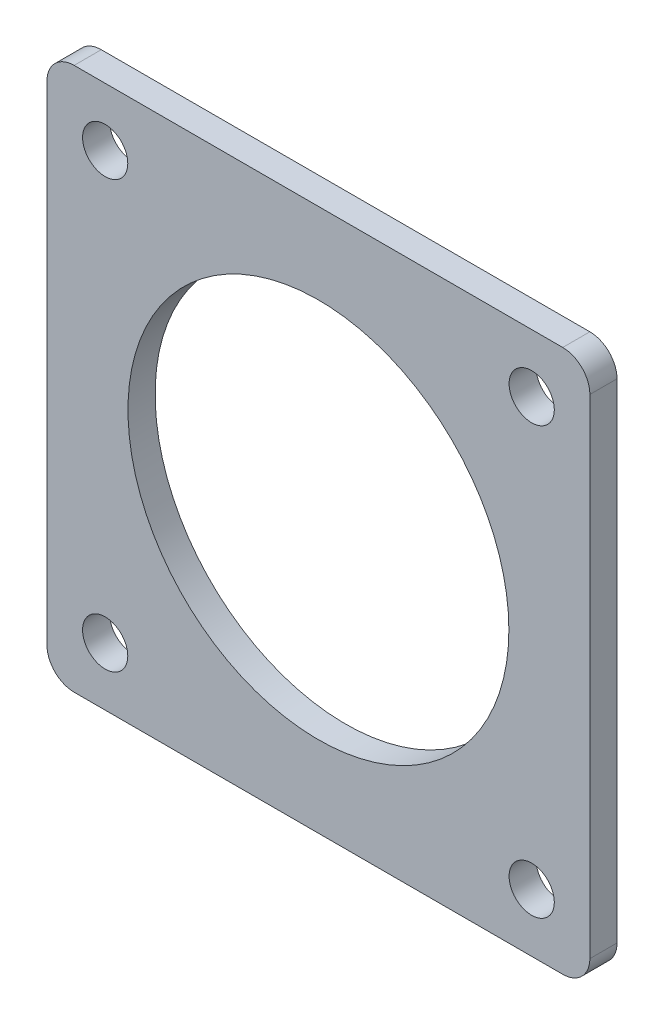
ISO-10303-21;
HEADER;
FILE_DESCRIPTION(('STEP AP214'),'2;1');
FILE_NAME('part.step','',(''),(''),'','','');
FILE_SCHEMA(('AUTOMOTIVE_DESIGN { 1 0 10303 214 1 1 1 1 }'));
ENDSEC;
DATA;
#1=APPLICATION_CONTEXT('core data for automotive mechanical design processes');
#2=APPLICATION_PROTOCOL_DEFINITION('international standard','automotive_design',2000,#1);
#3=PRODUCT_CONTEXT('',#1,'mechanical');
#4=PRODUCT('Part','Part','',(#3));
#5=PRODUCT_RELATED_PRODUCT_CATEGORY('part','',(#4));
#6=PRODUCT_DEFINITION_FORMATION('','',#4);
#7=PRODUCT_DEFINITION_CONTEXT('part definition',#1,'design');
#8=PRODUCT_DEFINITION('design','',#6,#7);
#9=PRODUCT_DEFINITION_SHAPE('','',#8);
#10=(LENGTH_UNIT() NAMED_UNIT(*) SI_UNIT(.MILLI.,.METRE.));
#11=(NAMED_UNIT(*) PLANE_ANGLE_UNIT() SI_UNIT($,.RADIAN.));
#12=(NAMED_UNIT(*) SI_UNIT($,.STERADIAN.) SOLID_ANGLE_UNIT());
#13=UNCERTAINTY_MEASURE_WITH_UNIT(LENGTH_MEASURE(1.E-05),#10,'distance_accuracy_value','');
#14=(GEOMETRIC_REPRESENTATION_CONTEXT(3) GLOBAL_UNCERTAINTY_ASSIGNED_CONTEXT((#13)) GLOBAL_UNIT_ASSIGNED_CONTEXT((#10,
#11,#12)) REPRESENTATION_CONTEXT('',''));
#15=CARTESIAN_POINT('',(0.,0.,0.));
#16=DIRECTION('',(0.,0.,1.));
#17=DIRECTION('',(1.,0.,0.));
#18=AXIS2_PLACEMENT_3D('',#15,#16,#17);
#19=CARTESIAN_POINT('',(0.,0.,3.));
#20=DIRECTION('',(0.,0.,-1.));
#21=DIRECTION('',(-1.,0.,0.));
#22=AXIS2_PLACEMENT_3D('',#19,#20,#21);
#23=PLANE('',#22);
#24=DIRECTION('',(0.,-1.,0.));
#25=VECTOR('',#24,1.);
#26=CARTESIAN_POINT('',(-19.6885352708654,9.34371165397001,3.));
#27=LINE('',#26,#25);
#28=CARTESIAN_POINT('',(-19.6885352708654,66.34371165397,3.));
#29=VERTEX_POINT('',#28);
#30=CARTESIAN_POINT('',(-19.6885352708654,12.34371165397,3.));
#31=VERTEX_POINT('',#30);
#32=EDGE_CURVE('E151',#29,#31,#27,.T.);
#33=ORIENTED_EDGE('',*,*,#32,.T.);
#34=CARTESIAN_POINT('',(-16.6885352708654,12.34371165397,3.));
#35=DIRECTION('',(0.,0.,-1.));
#36=DIRECTION('',(-1.,0.,0.));
#37=AXIS2_PLACEMENT_3D('',#34,#35,#36);
#38=CIRCLE('',#37,3.);
#39=CARTESIAN_POINT('',(-16.6885352708654,9.34371165397001,3.));
#40=VERTEX_POINT('',#39);
#41=EDGE_CURVE('E181',#31,#40,#38,.F.);
#42=ORIENTED_EDGE('',*,*,#41,.T.);
#43=DIRECTION('',(1.,0.,0.));
#44=VECTOR('',#43,1.);
#45=CARTESIAN_POINT('',(40.3114647291346,9.34371165397001,3.));
#46=LINE('',#45,#44);
#47=CARTESIAN_POINT('',(37.3114647291346,9.34371165397001,3.));
#48=VERTEX_POINT('',#47);
#49=EDGE_CURVE('E130',#40,#48,#46,.T.);
#50=ORIENTED_EDGE('',*,*,#49,.T.);
#51=CARTESIAN_POINT('',(37.3114647291346,12.34371165397,3.));
#52=DIRECTION('',(0.,0.,-1.));
#53=DIRECTION('',(-1.,0.,0.));
#54=AXIS2_PLACEMENT_3D('',#51,#52,#53);
#55=CIRCLE('',#54,3.);
#56=CARTESIAN_POINT('',(40.3114647291346,12.34371165397,3.));
#57=VERTEX_POINT('',#56);
#58=EDGE_CURVE('E178',#48,#57,#55,.F.);
#59=ORIENTED_EDGE('',*,*,#58,.T.);
#60=DIRECTION('',(0.,1.,0.));
#61=VECTOR('',#60,1.);
#62=CARTESIAN_POINT('',(40.3114647291346,69.34371165397,3.));
#63=LINE('',#62,#61);
#64=CARTESIAN_POINT('',(40.3114647291346,66.34371165397,3.));
#65=VERTEX_POINT('',#64);
#66=EDGE_CURVE('E207',#57,#65,#63,.T.);
#67=ORIENTED_EDGE('',*,*,#66,.T.);
#68=CARTESIAN_POINT('',(37.3114647291346,66.34371165397,3.));
#69=DIRECTION('',(0.,0.,-1.));
#70=DIRECTION('',(-1.,0.,0.));
#71=AXIS2_PLACEMENT_3D('',#68,#69,#70);
#72=CIRCLE('',#71,3.);
#73=CARTESIAN_POINT('',(37.3114647291346,69.34371165397,3.));
#74=VERTEX_POINT('',#73);
#75=EDGE_CURVE('E64',#65,#74,#72,.F.);
#76=ORIENTED_EDGE('',*,*,#75,.T.);
#77=DIRECTION('',(-1.,0.,0.));
#78=VECTOR('',#77,1.);
#79=CARTESIAN_POINT('',(-19.6885352708654,69.34371165397,3.));
#80=LINE('',#79,#78);
#81=CARTESIAN_POINT('',(-16.6885352708654,69.34371165397,3.));
#82=VERTEX_POINT('',#81);
#83=EDGE_CURVE('E195',#74,#82,#80,.T.);
#84=ORIENTED_EDGE('',*,*,#83,.T.);
#85=CARTESIAN_POINT('',(-16.6885352708654,66.34371165397,3.));
#86=DIRECTION('',(0.,0.,-1.));
#87=DIRECTION('',(-1.,0.,0.));
#88=AXIS2_PLACEMENT_3D('',#85,#86,#87);
#89=CIRCLE('',#88,3.);
#90=EDGE_CURVE('E175',#82,#29,#89,.F.);
#91=ORIENTED_EDGE('',*,*,#90,.T.);
#92=EDGE_LOOP('',(#33,#42,#50,#59,#67,#76,#84,#91));
#93=FACE_BOUND('',#92,.T.);
#94=CARTESIAN_POINT('',(33.8814647291348,15.77371165397,3.));
#95=DIRECTION('',(0.,0.,1.));
#96=DIRECTION('',(1.,0.,0.));
#97=AXIS2_PLACEMENT_3D('',#94,#95,#96);
#98=CIRCLE('',#97,2.49999999999998);
#99=CARTESIAN_POINT('',(36.3814647291347,15.77371165397,3.));
#100=VERTEX_POINT('',#99);
#101=EDGE_CURVE('E140',#100,#100,#98,.T.);
#102=ORIENTED_EDGE('',*,*,#101,.F.);
#103=EDGE_LOOP('',(#102));
#104=FACE_BOUND('',#103,.T.);
#105=CARTESIAN_POINT('',(-13.2585352708652,15.77371165397,3.));
#106=DIRECTION('',(0.,0.,1.));
#107=DIRECTION('',(1.,0.,0.));
#108=AXIS2_PLACEMENT_3D('',#105,#106,#107);
#109=CIRCLE('',#108,2.49999999999998);
#110=CARTESIAN_POINT('',(-10.7585352708652,15.77371165397,3.));
#111=VERTEX_POINT('',#110);
#112=EDGE_CURVE('E215',#111,#111,#109,.T.);
#113=ORIENTED_EDGE('',*,*,#112,.F.);
#114=EDGE_LOOP('',(#113));
#115=FACE_BOUND('',#114,.T.);
#116=CARTESIAN_POINT('',(-13.2585352708651,62.9137116539699,3.));
#117=DIRECTION('',(0.,0.,1.));
#118=DIRECTION('',(1.,0.,0.));
#119=AXIS2_PLACEMENT_3D('',#116,#117,#118);
#120=CIRCLE('',#119,2.49999999999998);
#121=CARTESIAN_POINT('',(-10.7585352708651,62.9137116539699,3.));
#122=VERTEX_POINT('',#121);
#123=EDGE_CURVE('E221',#122,#122,#120,.T.);
#124=ORIENTED_EDGE('',*,*,#123,.F.);
#125=EDGE_LOOP('',(#124));
#126=FACE_BOUND('',#125,.T.);
#127=CARTESIAN_POINT('',(10.3114647291348,39.3437116539699,3.));
#128=DIRECTION('',(0.,0.,1.));
#129=DIRECTION('',(1.,0.,0.));
#130=AXIS2_PLACEMENT_3D('',#127,#128,#129);
#131=CIRCLE('',#130,21.05);
#132=CARTESIAN_POINT('',(31.3614647291348,39.3437116539699,3.));
#133=VERTEX_POINT('',#132);
#134=EDGE_CURVE('E229',#133,#133,#131,.T.);
#135=ORIENTED_EDGE('',*,*,#134,.F.);
#136=EDGE_LOOP('',(#135));
#137=FACE_BOUND('',#136,.T.);
#138=CARTESIAN_POINT('',(33.8814647291349,62.9137116539698,3.));
#139=DIRECTION('',(0.,0.,1.));
#140=DIRECTION('',(1.,0.,0.));
#141=AXIS2_PLACEMENT_3D('',#138,#139,#140);
#142=CIRCLE('',#141,2.49999999999998);
#143=CARTESIAN_POINT('',(36.3814647291349,62.9137116539698,3.));
#144=VERTEX_POINT('',#143);
#145=EDGE_CURVE('E237',#144,#144,#142,.T.);
#146=ORIENTED_EDGE('',*,*,#145,.F.);
#147=EDGE_LOOP('',(#146));
#148=FACE_BOUND('',#147,.T.);
#149=ADVANCED_FACE('F43',(#93,#104,#115,#126,#137,#148),#23,.F.);
#150=CARTESIAN_POINT('',(0.,0.,0.));
#151=DIRECTION('',(0.,0.,-1.));
#152=DIRECTION('',(-1.,0.,0.));
#153=AXIS2_PLACEMENT_3D('',#150,#151,#152);
#154=PLANE('',#153);
#155=CARTESIAN_POINT('',(10.3114647291348,39.3437116539699,0.));
#156=DIRECTION('',(0.,0.,1.));
#157=DIRECTION('',(1.,0.,0.));
#158=AXIS2_PLACEMENT_3D('',#155,#156,#157);
#159=CIRCLE('',#158,21.05);
#160=CARTESIAN_POINT('',(31.3614647291348,39.3437116539699,0.));
#161=VERTEX_POINT('',#160);
#162=EDGE_CURVE('E233',#161,#161,#159,.T.);
#163=ORIENTED_EDGE('',*,*,#162,.T.);
#164=EDGE_LOOP('',(#163));
#165=FACE_BOUND('',#164,.T.);
#166=CARTESIAN_POINT('',(-13.2585352708652,15.77371165397,0.));
#167=DIRECTION('',(0.,0.,1.));
#168=DIRECTION('',(1.,0.,0.));
#169=AXIS2_PLACEMENT_3D('',#166,#167,#168);
#170=CIRCLE('',#169,2.49999999999998);
#171=CARTESIAN_POINT('',(-10.7585352708652,15.77371165397,0.));
#172=VERTEX_POINT('',#171);
#173=EDGE_CURVE('E217',#172,#172,#170,.T.);
#174=ORIENTED_EDGE('',*,*,#173,.T.);
#175=EDGE_LOOP('',(#174));
#176=FACE_BOUND('',#175,.T.);
#177=DIRECTION('',(1.,0.,0.));
#178=VECTOR('',#177,1.);
#179=CARTESIAN_POINT('',(40.3114647291346,9.34371165397001,0.));
#180=LINE('',#179,#178);
#181=CARTESIAN_POINT('',(-16.6885352708654,9.34371165397001,0.));
#182=VERTEX_POINT('',#181);
#183=CARTESIAN_POINT('',(37.3114647291346,9.34371165397001,0.));
#184=VERTEX_POINT('',#183);
#185=EDGE_CURVE('E127',#182,#184,#180,.T.);
#186=ORIENTED_EDGE('',*,*,#185,.F.);
#187=CARTESIAN_POINT('',(-16.6885352708654,12.34371165397,0.));
#188=DIRECTION('',(0.,0.,-1.));
#189=DIRECTION('',(-1.,0.,0.));
#190=AXIS2_PLACEMENT_3D('',#187,#188,#189);
#191=CIRCLE('',#190,3.);
#192=CARTESIAN_POINT('',(-19.6885352708654,12.34371165397,0.));
#193=VERTEX_POINT('',#192);
#194=EDGE_CURVE('E109',#182,#193,#191,.T.);
#195=ORIENTED_EDGE('',*,*,#194,.T.);
#196=DIRECTION('',(0.,-1.,0.));
#197=VECTOR('',#196,1.);
#198=CARTESIAN_POINT('',(-19.6885352708654,9.34371165397001,0.));
#199=LINE('',#198,#197);
#200=CARTESIAN_POINT('',(-19.6885352708654,66.34371165397,0.));
#201=VERTEX_POINT('',#200);
#202=EDGE_CURVE('E156',#201,#193,#199,.T.);
#203=ORIENTED_EDGE('',*,*,#202,.F.);
#204=CARTESIAN_POINT('',(-16.6885352708654,66.34371165397,0.));
#205=DIRECTION('',(0.,0.,-1.));
#206=DIRECTION('',(-1.,0.,0.));
#207=AXIS2_PLACEMENT_3D('',#204,#205,#206);
#208=CIRCLE('',#207,3.);
#209=CARTESIAN_POINT('',(-16.6885352708654,69.34371165397,0.));
#210=VERTEX_POINT('',#209);
#211=EDGE_CURVE('E163',#201,#210,#208,.T.);
#212=ORIENTED_EDGE('',*,*,#211,.T.);
#213=DIRECTION('',(-1.,0.,0.));
#214=VECTOR('',#213,1.);
#215=CARTESIAN_POINT('',(-19.6885352708654,69.34371165397,0.));
#216=LINE('',#215,#214);
#217=CARTESIAN_POINT('',(37.3114647291346,69.34371165397,0.));
#218=VERTEX_POINT('',#217);
#219=EDGE_CURVE('E145',#218,#210,#216,.T.);
#220=ORIENTED_EDGE('',*,*,#219,.F.);
#221=CARTESIAN_POINT('',(37.3114647291346,66.34371165397,0.));
#222=DIRECTION('',(0.,0.,-1.));
#223=DIRECTION('',(-1.,0.,0.));
#224=AXIS2_PLACEMENT_3D('',#221,#222,#223);
#225=CIRCLE('',#224,3.);
#226=CARTESIAN_POINT('',(40.3114647291346,66.34371165397,0.));
#227=VERTEX_POINT('',#226);
#228=EDGE_CURVE('E132',#218,#227,#225,.T.);
#229=ORIENTED_EDGE('',*,*,#228,.T.);
#230=DIRECTION('',(0.,1.,0.));
#231=VECTOR('',#230,1.);
#232=CARTESIAN_POINT('',(40.3114647291346,69.34371165397,0.));
#233=LINE('',#232,#231);
#234=CARTESIAN_POINT('',(40.3114647291346,12.34371165397,0.));
#235=VERTEX_POINT('',#234);
#236=EDGE_CURVE('E139',#235,#227,#233,.T.);
#237=ORIENTED_EDGE('',*,*,#236,.F.);
#238=CARTESIAN_POINT('',(37.3114647291346,12.34371165397,0.));
#239=DIRECTION('',(0.,0.,-1.));
#240=DIRECTION('',(-1.,0.,0.));
#241=AXIS2_PLACEMENT_3D('',#238,#239,#240);
#242=CIRCLE('',#241,3.);
#243=EDGE_CURVE('E121',#235,#184,#242,.T.);
#244=ORIENTED_EDGE('',*,*,#243,.T.);
#245=EDGE_LOOP('',(#186,#195,#203,#212,#220,#229,#237,#244));
#246=FACE_BOUND('',#245,.T.);
#247=CARTESIAN_POINT('',(33.8814647291348,15.77371165397,0.));
#248=DIRECTION('',(0.,0.,1.));
#249=DIRECTION('',(1.,0.,0.));
#250=AXIS2_PLACEMENT_3D('',#247,#248,#249);
#251=CIRCLE('',#250,2.49999999999998);
#252=CARTESIAN_POINT('',(36.3814647291347,15.77371165397,0.));
#253=VERTEX_POINT('',#252);
#254=EDGE_CURVE('E148',#253,#253,#251,.T.);
#255=ORIENTED_EDGE('',*,*,#254,.T.);
#256=EDGE_LOOP('',(#255));
#257=FACE_BOUND('',#256,.T.);
#258=CARTESIAN_POINT('',(-13.2585352708651,62.9137116539699,0.));
#259=DIRECTION('',(0.,0.,1.));
#260=DIRECTION('',(1.,0.,0.));
#261=AXIS2_PLACEMENT_3D('',#258,#259,#260);
#262=CIRCLE('',#261,2.49999999999998);
#263=CARTESIAN_POINT('',(-10.7585352708651,62.9137116539699,0.));
#264=VERTEX_POINT('',#263);
#265=EDGE_CURVE('E225',#264,#264,#262,.T.);
#266=ORIENTED_EDGE('',*,*,#265,.T.);
#267=EDGE_LOOP('',(#266));
#268=FACE_BOUND('',#267,.T.);
#269=CARTESIAN_POINT('',(33.8814647291349,62.9137116539698,0.));
#270=DIRECTION('',(0.,0.,1.));
#271=DIRECTION('',(1.,0.,0.));
#272=AXIS2_PLACEMENT_3D('',#269,#270,#271);
#273=CIRCLE('',#272,2.49999999999998);
#274=CARTESIAN_POINT('',(36.3814647291349,62.9137116539698,0.));
#275=VERTEX_POINT('',#274);
#276=EDGE_CURVE('E241',#275,#275,#273,.T.);
#277=ORIENTED_EDGE('',*,*,#276,.T.);
#278=EDGE_LOOP('',(#277));
#279=FACE_BOUND('',#278,.T.);
#280=ADVANCED_FACE('F135',(#165,#176,#246,#257,#268,#279),#154,.T.);
#281=CARTESIAN_POINT('',(40.3114647291346,9.34371165397001,3.));
#282=DIRECTION('',(0.,1.,0.));
#283=DIRECTION('',(0.,0.,1.));
#284=AXIS2_PLACEMENT_3D('',#281,#282,#283);
#285=PLANE('',#284);
#286=ORIENTED_EDGE('',*,*,#49,.F.);
#287=DIRECTION('',(0.,0.,-1.));
#288=VECTOR('',#287,1.);
#289=CARTESIAN_POINT('',(-16.6885352708654,9.34371165397001,3.));
#290=LINE('',#289,#288);
#291=EDGE_CURVE('E113',#40,#182,#290,.T.);
#292=ORIENTED_EDGE('',*,*,#291,.T.);
#293=ORIENTED_EDGE('',*,*,#185,.T.);
#294=DIRECTION('',(0.,0.,-1.));
#295=VECTOR('',#294,1.);
#296=CARTESIAN_POINT('',(37.3114647291346,9.34371165397001,3.));
#297=LINE('',#296,#295);
#298=EDGE_CURVE('E133',#184,#48,#297,.F.);
#299=ORIENTED_EDGE('',*,*,#298,.T.);
#300=EDGE_LOOP('',(#286,#292,#293,#299));
#301=FACE_BOUND('',#300,.T.);
#302=ADVANCED_FACE('F126',(#301),#285,.F.);
#303=CARTESIAN_POINT('',(40.3114647291346,69.34371165397,3.));
#304=DIRECTION('',(-1.,0.,0.));
#305=DIRECTION('',(0.,0.,1.));
#306=AXIS2_PLACEMENT_3D('',#303,#304,#305);
#307=PLANE('',#306);
#308=ORIENTED_EDGE('',*,*,#66,.F.);
#309=DIRECTION('',(0.,0.,-1.));
#310=VECTOR('',#309,1.);
#311=CARTESIAN_POINT('',(40.3114647291346,12.34371165397,3.));
#312=LINE('',#311,#310);
#313=EDGE_CURVE('E187',#57,#235,#312,.T.);
#314=ORIENTED_EDGE('',*,*,#313,.T.);
#315=ORIENTED_EDGE('',*,*,#236,.T.);
#316=DIRECTION('',(0.,0.,-1.));
#317=VECTOR('',#316,1.);
#318=CARTESIAN_POINT('',(40.3114647291346,66.34371165397,3.));
#319=LINE('',#318,#317);
#320=EDGE_CURVE('E184',#227,#65,#319,.F.);
#321=ORIENTED_EDGE('',*,*,#320,.T.);
#322=EDGE_LOOP('',(#308,#314,#315,#321));
#323=FACE_BOUND('',#322,.T.);
#324=ADVANCED_FACE('F268',(#323),#307,.F.);
#325=CARTESIAN_POINT('',(-19.6885352708654,69.34371165397,3.));
#326=DIRECTION('',(0.,-1.,0.));
#327=DIRECTION('',(0.,0.,-1.));
#328=AXIS2_PLACEMENT_3D('',#325,#326,#327);
#329=PLANE('',#328);
#330=ORIENTED_EDGE('',*,*,#219,.T.);
#331=DIRECTION('',(0.,0.,-1.));
#332=VECTOR('',#331,1.);
#333=CARTESIAN_POINT('',(-16.6885352708654,69.34371165397,3.));
#334=LINE('',#333,#332);
#335=EDGE_CURVE('E11',#210,#82,#334,.F.);
#336=ORIENTED_EDGE('',*,*,#335,.T.);
#337=ORIENTED_EDGE('',*,*,#83,.F.);
#338=DIRECTION('',(0.,0.,-1.));
#339=VECTOR('',#338,1.);
#340=CARTESIAN_POINT('',(37.3114647291346,69.34371165397,3.));
#341=LINE('',#340,#339);
#342=EDGE_CURVE('E52',#74,#218,#341,.T.);
#343=ORIENTED_EDGE('',*,*,#342,.T.);
#344=EDGE_LOOP('',(#330,#336,#337,#343));
#345=FACE_BOUND('',#344,.T.);
#346=ADVANCED_FACE('F194',(#345),#329,.F.);
#347=CARTESIAN_POINT('',(-19.6885352708654,9.34371165397001,3.));
#348=DIRECTION('',(1.,0.,0.));
#349=DIRECTION('',(0.,0.,-1.));
#350=AXIS2_PLACEMENT_3D('',#347,#348,#349);
#351=PLANE('',#350);
#352=ORIENTED_EDGE('',*,*,#202,.T.);
#353=DIRECTION('',(0.,0.,-1.));
#354=VECTOR('',#353,1.);
#355=CARTESIAN_POINT('',(-19.6885352708654,12.34371165397,3.));
#356=LINE('',#355,#354);
#357=EDGE_CURVE('E114',#193,#31,#356,.F.);
#358=ORIENTED_EDGE('',*,*,#357,.T.);
#359=ORIENTED_EDGE('',*,*,#32,.F.);
#360=DIRECTION('',(0.,0.,-1.));
#361=VECTOR('',#360,1.);
#362=CARTESIAN_POINT('',(-19.6885352708654,66.34371165397,3.));
#363=LINE('',#362,#361);
#364=EDGE_CURVE('E120',#29,#201,#363,.T.);
#365=ORIENTED_EDGE('',*,*,#364,.T.);
#366=EDGE_LOOP('',(#352,#358,#359,#365));
#367=FACE_BOUND('',#366,.T.);
#368=ADVANCED_FACE('F203',(#367),#351,.F.);
#369=CARTESIAN_POINT('',(33.8814647291348,15.77371165397,3.));
#370=DIRECTION('',(0.,0.,-1.));
#371=DIRECTION('',(-1.,0.,0.));
#372=AXIS2_PLACEMENT_3D('',#369,#370,#371);
#373=CYLINDRICAL_SURFACE('',#372,2.49999999999998);
#374=ORIENTED_EDGE('',*,*,#101,.T.);
#375=EDGE_LOOP('',(#374));
#376=FACE_BOUND('',#375,.T.);
#377=ORIENTED_EDGE('',*,*,#254,.F.);
#378=EDGE_LOOP('',(#377));
#379=FACE_BOUND('',#378,.T.);
#380=ADVANCED_FACE('F261',(#376,#379),#373,.F.);
#381=CARTESIAN_POINT('',(-13.2585352708652,15.77371165397,3.));
#382=DIRECTION('',(0.,0.,-1.));
#383=DIRECTION('',(-1.,0.,0.));
#384=AXIS2_PLACEMENT_3D('',#381,#382,#383);
#385=CYLINDRICAL_SURFACE('',#384,2.49999999999998);
#386=ORIENTED_EDGE('',*,*,#112,.T.);
#387=EDGE_LOOP('',(#386));
#388=FACE_BOUND('',#387,.T.);
#389=ORIENTED_EDGE('',*,*,#173,.F.);
#390=EDGE_LOOP('',(#389));
#391=FACE_BOUND('',#390,.T.);
#392=ADVANCED_FACE('F381',(#388,#391),#385,.F.);
#393=CARTESIAN_POINT('',(-13.2585352708651,62.9137116539699,3.));
#394=DIRECTION('',(0.,0.,-1.));
#395=DIRECTION('',(-1.,0.,0.));
#396=AXIS2_PLACEMENT_3D('',#393,#394,#395);
#397=CYLINDRICAL_SURFACE('',#396,2.49999999999998);
#398=ORIENTED_EDGE('',*,*,#123,.T.);
#399=EDGE_LOOP('',(#398));
#400=FACE_BOUND('',#399,.T.);
#401=ORIENTED_EDGE('',*,*,#265,.F.);
#402=EDGE_LOOP('',(#401));
#403=FACE_BOUND('',#402,.T.);
#404=ADVANCED_FACE('F370',(#400,#403),#397,.F.);
#405=CARTESIAN_POINT('',(10.3114647291348,39.3437116539699,3.));
#406=DIRECTION('',(0.,0.,-1.));
#407=DIRECTION('',(-1.,0.,0.));
#408=AXIS2_PLACEMENT_3D('',#405,#406,#407);
#409=CYLINDRICAL_SURFACE('',#408,21.05);
#410=ORIENTED_EDGE('',*,*,#134,.T.);
#411=EDGE_LOOP('',(#410));
#412=FACE_BOUND('',#411,.T.);
#413=ORIENTED_EDGE('',*,*,#162,.F.);
#414=EDGE_LOOP('',(#413));
#415=FACE_BOUND('',#414,.T.);
#416=ADVANCED_FACE('F360',(#412,#415),#409,.F.);
#417=CARTESIAN_POINT('',(33.8814647291349,62.9137116539698,3.));
#418=DIRECTION('',(0.,0.,-1.));
#419=DIRECTION('',(-1.,0.,0.));
#420=AXIS2_PLACEMENT_3D('',#417,#418,#419);
#421=CYLINDRICAL_SURFACE('',#420,2.49999999999998);
#422=ORIENTED_EDGE('',*,*,#145,.T.);
#423=EDGE_LOOP('',(#422));
#424=FACE_BOUND('',#423,.T.);
#425=ORIENTED_EDGE('',*,*,#276,.F.);
#426=EDGE_LOOP('',(#425));
#427=FACE_BOUND('',#426,.T.);
#428=ADVANCED_FACE('F249',(#424,#427),#421,.F.);
#429=CARTESIAN_POINT('',(-16.6885352708654,12.34371165397,3.));
#430=DIRECTION('',(0.,0.,-1.));
#431=DIRECTION('',(-1.,0.,0.));
#432=AXIS2_PLACEMENT_3D('',#429,#430,#431);
#433=CYLINDRICAL_SURFACE('',#432,3.);
#434=ORIENTED_EDGE('',*,*,#41,.F.);
#435=ORIENTED_EDGE('',*,*,#357,.F.);
#436=ORIENTED_EDGE('',*,*,#194,.F.);
#437=ORIENTED_EDGE('',*,*,#291,.F.);
#438=EDGE_LOOP('',(#434,#435,#436,#437));
#439=FACE_BOUND('',#438,.T.);
#440=ADVANCED_FACE('F112',(#439),#433,.T.);
#441=CARTESIAN_POINT('',(37.3114647291346,12.34371165397,3.));
#442=DIRECTION('',(0.,0.,-1.));
#443=DIRECTION('',(-1.,0.,0.));
#444=AXIS2_PLACEMENT_3D('',#441,#442,#443);
#445=CYLINDRICAL_SURFACE('',#444,3.);
#446=ORIENTED_EDGE('',*,*,#58,.F.);
#447=ORIENTED_EDGE('',*,*,#298,.F.);
#448=ORIENTED_EDGE('',*,*,#243,.F.);
#449=ORIENTED_EDGE('',*,*,#313,.F.);
#450=EDGE_LOOP('',(#446,#447,#448,#449));
#451=FACE_BOUND('',#450,.T.);
#452=ADVANCED_FACE('F276',(#451),#445,.T.);
#453=CARTESIAN_POINT('',(-16.6885352708654,66.34371165397,3.));
#454=DIRECTION('',(0.,0.,-1.));
#455=DIRECTION('',(-1.,0.,0.));
#456=AXIS2_PLACEMENT_3D('',#453,#454,#455);
#457=CYLINDRICAL_SURFACE('',#456,3.);
#458=ORIENTED_EDGE('',*,*,#90,.F.);
#459=ORIENTED_EDGE('',*,*,#335,.F.);
#460=ORIENTED_EDGE('',*,*,#211,.F.);
#461=ORIENTED_EDGE('',*,*,#364,.F.);
#462=EDGE_LOOP('',(#458,#459,#460,#461));
#463=FACE_BOUND('',#462,.T.);
#464=ADVANCED_FACE('F200',(#463),#457,.T.);
#465=CARTESIAN_POINT('',(37.3114647291346,66.34371165397,3.));
#466=DIRECTION('',(0.,0.,-1.));
#467=DIRECTION('',(-1.,0.,0.));
#468=AXIS2_PLACEMENT_3D('',#465,#466,#467);
#469=CYLINDRICAL_SURFACE('',#468,3.);
#470=ORIENTED_EDGE('',*,*,#75,.F.);
#471=ORIENTED_EDGE('',*,*,#320,.F.);
#472=ORIENTED_EDGE('',*,*,#228,.F.);
#473=ORIENTED_EDGE('',*,*,#342,.F.);
#474=EDGE_LOOP('',(#470,#471,#472,#473));
#475=FACE_BOUND('',#474,.T.);
#476=ADVANCED_FACE('F45',(#475),#469,.T.);
#477=CLOSED_SHELL('',(#149,#280,#302,#324,#346,#368,#380,#392,#404,#416,#428,#440,#452,#464,#476));
#478=MANIFOLD_SOLID_BREP('B2',#477);
#479=ADVANCED_BREP_SHAPE_REPRESENTATION('',(#18,#478),#14);
#480=SHAPE_DEFINITION_REPRESENTATION(#9,#479);
ENDSEC;
END-ISO-10303-21;
